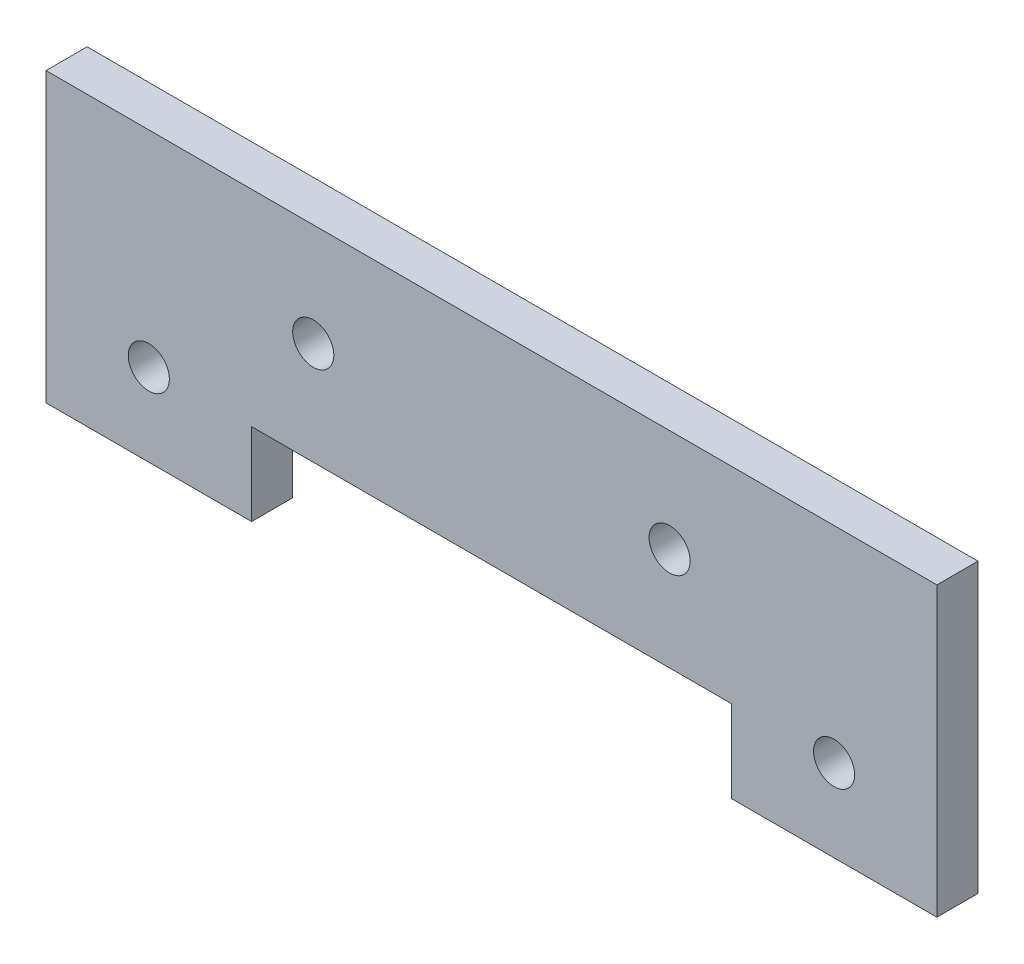
ISO-10303-21;
HEADER;
FILE_DESCRIPTION(('STEP AP214'),'2;1');
FILE_NAME('part.step','',(''),(''),'','','');
FILE_SCHEMA(('AUTOMOTIVE_DESIGN { 1 0 10303 214 1 1 1 1 }'));
ENDSEC;
DATA;
#1=APPLICATION_CONTEXT('core data for automotive mechanical design processes');
#2=APPLICATION_PROTOCOL_DEFINITION('international standard','automotive_design',2000,#1);
#3=PRODUCT_CONTEXT('',#1,'mechanical');
#4=PRODUCT('Part','Part','',(#3));
#5=PRODUCT_RELATED_PRODUCT_CATEGORY('part','',(#4));
#6=PRODUCT_DEFINITION_FORMATION('','',#4);
#7=PRODUCT_DEFINITION_CONTEXT('part definition',#1,'design');
#8=PRODUCT_DEFINITION('design','',#6,#7);
#9=PRODUCT_DEFINITION_SHAPE('','',#8);
#10=(LENGTH_UNIT() NAMED_UNIT(*) SI_UNIT(.MILLI.,.METRE.));
#11=(NAMED_UNIT(*) PLANE_ANGLE_UNIT() SI_UNIT($,.RADIAN.));
#12=(NAMED_UNIT(*) SI_UNIT($,.STERADIAN.) SOLID_ANGLE_UNIT());
#13=UNCERTAINTY_MEASURE_WITH_UNIT(LENGTH_MEASURE(1.E-05),#10,'distance_accuracy_value','');
#14=(GEOMETRIC_REPRESENTATION_CONTEXT(3) GLOBAL_UNCERTAINTY_ASSIGNED_CONTEXT((#13)) GLOBAL_UNIT_ASSIGNED_CONTEXT((#10,
#11,#12)) REPRESENTATION_CONTEXT('',''));
#15=CARTESIAN_POINT('',(0.,0.,0.));
#16=DIRECTION('',(0.,0.,1.));
#17=DIRECTION('',(1.,0.,0.));
#18=AXIS2_PLACEMENT_3D('',#15,#16,#17);
#19=CARTESIAN_POINT('',(0.,-21.,3.));
#20=DIRECTION('',(1.,0.,0.));
#21=DIRECTION('',(0.,0.,-1.));
#22=AXIS2_PLACEMENT_3D('',#19,#20,#21);
#23=PLANE('',#22);
#24=DIRECTION('',(0.,-1.,0.));
#25=VECTOR('',#24,1.);
#26=CARTESIAN_POINT('',(0.,-21.,0.));
#27=LINE('',#26,#25);
#28=CARTESIAN_POINT('',(0.,0.,0.));
#29=VERTEX_POINT('',#28);
#30=CARTESIAN_POINT('',(0.,-21.,0.));
#31=VERTEX_POINT('',#30);
#32=EDGE_CURVE('E135',#29,#31,#27,.T.);
#33=ORIENTED_EDGE('',*,*,#32,.T.);
#34=DIRECTION('',(0.,0.,-1.));
#35=VECTOR('',#34,1.);
#36=CARTESIAN_POINT('',(0.,-21.,3.));
#37=LINE('',#36,#35);
#38=CARTESIAN_POINT('',(0.,-21.,3.));
#39=VERTEX_POINT('',#38);
#40=EDGE_CURVE('E11',#39,#31,#37,.T.);
#41=ORIENTED_EDGE('',*,*,#40,.F.);
#42=DIRECTION('',(0.,-1.,0.));
#43=VECTOR('',#42,1.);
#44=CARTESIAN_POINT('',(0.,-21.,3.));
#45=LINE('',#44,#43);
#46=CARTESIAN_POINT('',(0.,0.,3.));
#47=VERTEX_POINT('',#46);
#48=EDGE_CURVE('E150',#47,#39,#45,.T.);
#49=ORIENTED_EDGE('',*,*,#48,.F.);
#50=DIRECTION('',(0.,0.,-1.));
#51=VECTOR('',#50,1.);
#52=CARTESIAN_POINT('',(0.,0.,3.));
#53=LINE('',#52,#51);
#54=EDGE_CURVE('E131',#47,#29,#53,.T.);
#55=ORIENTED_EDGE('',*,*,#54,.T.);
#56=EDGE_LOOP('',(#33,#41,#49,#55));
#57=FACE_BOUND('',#56,.T.);
#58=ADVANCED_FACE('F39',(#57),#23,.F.);
#59=CARTESIAN_POINT('',(15.,-21.,3.));
#60=DIRECTION('',(0.,1.,0.));
#61=DIRECTION('',(-1.,0.,0.));
#62=AXIS2_PLACEMENT_3D('',#59,#60,#61);
#63=PLANE('',#62);
#64=DIRECTION('',(1.,0.,0.));
#65=VECTOR('',#64,1.);
#66=CARTESIAN_POINT('',(15.,-21.,0.));
#67=LINE('',#66,#65);
#68=CARTESIAN_POINT('',(15.,-21.,0.));
#69=VERTEX_POINT('',#68);
#70=EDGE_CURVE('E138',#31,#69,#67,.T.);
#71=ORIENTED_EDGE('',*,*,#70,.T.);
#72=DIRECTION('',(0.,0.,-1.));
#73=VECTOR('',#72,1.);
#74=CARTESIAN_POINT('',(15.,-21.,3.));
#75=LINE('',#74,#73);
#76=CARTESIAN_POINT('',(15.,-21.,3.));
#77=VERTEX_POINT('',#76);
#78=EDGE_CURVE('E47',#77,#69,#75,.T.);
#79=ORIENTED_EDGE('',*,*,#78,.F.);
#80=DIRECTION('',(1.,0.,0.));
#81=VECTOR('',#80,1.);
#82=CARTESIAN_POINT('',(15.,-21.,3.));
#83=LINE('',#82,#81);
#84=EDGE_CURVE('E98',#39,#77,#83,.T.);
#85=ORIENTED_EDGE('',*,*,#84,.F.);
#86=ORIENTED_EDGE('',*,*,#40,.T.);
#87=EDGE_LOOP('',(#71,#79,#85,#86));
#88=FACE_BOUND('',#87,.T.);
#89=ADVANCED_FACE('F241',(#88),#63,.F.);
#90=CARTESIAN_POINT('',(15.,-15.,3.));
#91=DIRECTION('',(-1.,0.,0.));
#92=DIRECTION('',(0.,-1.,0.));
#93=AXIS2_PLACEMENT_3D('',#90,#91,#92);
#94=PLANE('',#93);
#95=DIRECTION('',(0.,1.,0.));
#96=VECTOR('',#95,1.);
#97=CARTESIAN_POINT('',(15.,-15.,0.));
#98=LINE('',#97,#96);
#99=CARTESIAN_POINT('',(15.,-15.,0.));
#100=VERTEX_POINT('',#99);
#101=EDGE_CURVE('E141',#69,#100,#98,.T.);
#102=ORIENTED_EDGE('',*,*,#101,.T.);
#103=DIRECTION('',(0.,0.,-1.));
#104=VECTOR('',#103,1.);
#105=CARTESIAN_POINT('',(15.,-15.,3.));
#106=LINE('',#105,#104);
#107=CARTESIAN_POINT('',(15.,-15.,3.));
#108=VERTEX_POINT('',#107);
#109=EDGE_CURVE('E157',#108,#100,#106,.T.);
#110=ORIENTED_EDGE('',*,*,#109,.F.);
#111=DIRECTION('',(0.,1.,0.));
#112=VECTOR('',#111,1.);
#113=CARTESIAN_POINT('',(15.,-15.,3.));
#114=LINE('',#113,#112);
#115=EDGE_CURVE('E165',#77,#108,#114,.T.);
#116=ORIENTED_EDGE('',*,*,#115,.F.);
#117=ORIENTED_EDGE('',*,*,#78,.T.);
#118=EDGE_LOOP('',(#102,#110,#116,#117));
#119=FACE_BOUND('',#118,.T.);
#120=ADVANCED_FACE('F163',(#119),#94,.F.);
#121=CARTESIAN_POINT('',(50.,-15.,3.));
#122=DIRECTION('',(0.,1.,0.));
#123=DIRECTION('',(-1.,0.,0.));
#124=AXIS2_PLACEMENT_3D('',#121,#122,#123);
#125=PLANE('',#124);
#126=DIRECTION('',(1.,0.,0.));
#127=VECTOR('',#126,1.);
#128=CARTESIAN_POINT('',(50.,-15.,0.));
#129=LINE('',#128,#127);
#130=CARTESIAN_POINT('',(50.,-15.,0.));
#131=VERTEX_POINT('',#130);
#132=EDGE_CURVE('E143',#100,#131,#129,.T.);
#133=ORIENTED_EDGE('',*,*,#132,.T.);
#134=DIRECTION('',(0.,0.,-1.));
#135=VECTOR('',#134,1.);
#136=CARTESIAN_POINT('',(50.,-15.,3.));
#137=LINE('',#136,#135);
#138=CARTESIAN_POINT('',(50.,-15.,3.));
#139=VERTEX_POINT('',#138);
#140=EDGE_CURVE('E154',#139,#131,#137,.T.);
#141=ORIENTED_EDGE('',*,*,#140,.F.);
#142=DIRECTION('',(1.,0.,0.));
#143=VECTOR('',#142,1.);
#144=CARTESIAN_POINT('',(50.,-15.,3.));
#145=LINE('',#144,#143);
#146=EDGE_CURVE('E177',#108,#139,#145,.T.);
#147=ORIENTED_EDGE('',*,*,#146,.F.);
#148=ORIENTED_EDGE('',*,*,#109,.T.);
#149=EDGE_LOOP('',(#133,#141,#147,#148));
#150=FACE_BOUND('',#149,.T.);
#151=ADVANCED_FACE('F173',(#150),#125,.F.);
#152=CARTESIAN_POINT('',(50.,-21.,3.));
#153=DIRECTION('',(1.,0.,0.));
#154=DIRECTION('',(0.,0.,-1.));
#155=AXIS2_PLACEMENT_3D('',#152,#153,#154);
#156=PLANE('',#155);
#157=DIRECTION('',(0.,-1.,0.));
#158=VECTOR('',#157,1.);
#159=CARTESIAN_POINT('',(50.,-21.,0.));
#160=LINE('',#159,#158);
#161=CARTESIAN_POINT('',(50.,-21.,0.));
#162=VERTEX_POINT('',#161);
#163=EDGE_CURVE('E145',#131,#162,#160,.T.);
#164=ORIENTED_EDGE('',*,*,#163,.T.);
#165=DIRECTION('',(0.,0.,-1.));
#166=VECTOR('',#165,1.);
#167=CARTESIAN_POINT('',(50.,-21.,3.));
#168=LINE('',#167,#166);
#169=CARTESIAN_POINT('',(50.,-21.,3.));
#170=VERTEX_POINT('',#169);
#171=EDGE_CURVE('E126',#170,#162,#168,.T.);
#172=ORIENTED_EDGE('',*,*,#171,.F.);
#173=DIRECTION('',(0.,-1.,0.));
#174=VECTOR('',#173,1.);
#175=CARTESIAN_POINT('',(50.,-21.,3.));
#176=LINE('',#175,#174);
#177=EDGE_CURVE('E117',#139,#170,#176,.T.);
#178=ORIENTED_EDGE('',*,*,#177,.F.);
#179=ORIENTED_EDGE('',*,*,#140,.T.);
#180=EDGE_LOOP('',(#164,#172,#178,#179));
#181=FACE_BOUND('',#180,.T.);
#182=ADVANCED_FACE('F176',(#181),#156,.F.);
#183=CARTESIAN_POINT('',(65.,-21.,3.));
#184=DIRECTION('',(0.,1.,0.));
#185=DIRECTION('',(0.,0.,1.));
#186=AXIS2_PLACEMENT_3D('',#183,#184,#185);
#187=PLANE('',#186);
#188=DIRECTION('',(1.,0.,0.));
#189=VECTOR('',#188,1.);
#190=CARTESIAN_POINT('',(65.,-21.,0.));
#191=LINE('',#190,#189);
#192=CARTESIAN_POINT('',(65.,-21.,0.));
#193=VERTEX_POINT('',#192);
#194=EDGE_CURVE('E125',#162,#193,#191,.T.);
#195=ORIENTED_EDGE('',*,*,#194,.T.);
#196=DIRECTION('',(0.,0.,-1.));
#197=VECTOR('',#196,1.);
#198=CARTESIAN_POINT('',(65.,-21.,3.));
#199=LINE('',#198,#197);
#200=CARTESIAN_POINT('',(65.,-21.,3.));
#201=VERTEX_POINT('',#200);
#202=EDGE_CURVE('E122',#201,#193,#199,.T.);
#203=ORIENTED_EDGE('',*,*,#202,.F.);
#204=DIRECTION('',(1.,0.,0.));
#205=VECTOR('',#204,1.);
#206=CARTESIAN_POINT('',(65.,-21.,3.));
#207=LINE('',#206,#205);
#208=EDGE_CURVE('E111',#170,#201,#207,.T.);
#209=ORIENTED_EDGE('',*,*,#208,.F.);
#210=ORIENTED_EDGE('',*,*,#171,.T.);
#211=EDGE_LOOP('',(#195,#203,#209,#210));
#212=FACE_BOUND('',#211,.T.);
#213=ADVANCED_FACE('F123',(#212),#187,.F.);
#214=CARTESIAN_POINT('',(65.,0.,3.));
#215=DIRECTION('',(-1.,0.,0.));
#216=DIRECTION('',(0.,0.,1.));
#217=AXIS2_PLACEMENT_3D('',#214,#215,#216);
#218=PLANE('',#217);
#219=DIRECTION('',(0.,1.,0.));
#220=VECTOR('',#219,1.);
#221=CARTESIAN_POINT('',(65.,0.,0.));
#222=LINE('',#221,#220);
#223=CARTESIAN_POINT('',(65.,0.,0.));
#224=VERTEX_POINT('',#223);
#225=EDGE_CURVE('E84',#193,#224,#222,.T.);
#226=ORIENTED_EDGE('',*,*,#225,.T.);
#227=DIRECTION('',(0.,0.,-1.));
#228=VECTOR('',#227,1.);
#229=CARTESIAN_POINT('',(65.,0.,3.));
#230=LINE('',#229,#228);
#231=CARTESIAN_POINT('',(65.,0.,3.));
#232=VERTEX_POINT('',#231);
#233=EDGE_CURVE('E127',#232,#224,#230,.T.);
#234=ORIENTED_EDGE('',*,*,#233,.F.);
#235=DIRECTION('',(0.,1.,0.));
#236=VECTOR('',#235,1.);
#237=CARTESIAN_POINT('',(65.,0.,3.));
#238=LINE('',#237,#236);
#239=EDGE_CURVE('E115',#201,#232,#238,.T.);
#240=ORIENTED_EDGE('',*,*,#239,.F.);
#241=ORIENTED_EDGE('',*,*,#202,.T.);
#242=EDGE_LOOP('',(#226,#234,#240,#241));
#243=FACE_BOUND('',#242,.T.);
#244=ADVANCED_FACE('F129',(#243),#218,.F.);
#245=CARTESIAN_POINT('',(0.,0.,3.));
#246=DIRECTION('',(0.,-1.,0.));
#247=DIRECTION('',(0.,0.,-1.));
#248=AXIS2_PLACEMENT_3D('',#245,#246,#247);
#249=PLANE('',#248);
#250=DIRECTION('',(-1.,0.,0.));
#251=VECTOR('',#250,1.);
#252=CARTESIAN_POINT('',(0.,0.,0.));
#253=LINE('',#252,#251);
#254=EDGE_CURVE('E90',#224,#29,#253,.T.);
#255=ORIENTED_EDGE('',*,*,#254,.T.);
#256=ORIENTED_EDGE('',*,*,#54,.F.);
#257=DIRECTION('',(-1.,0.,0.));
#258=VECTOR('',#257,1.);
#259=CARTESIAN_POINT('',(0.,0.,3.));
#260=LINE('',#259,#258);
#261=EDGE_CURVE('E55',#232,#47,#260,.T.);
#262=ORIENTED_EDGE('',*,*,#261,.F.);
#263=ORIENTED_EDGE('',*,*,#233,.T.);
#264=EDGE_LOOP('',(#255,#256,#262,#263));
#265=FACE_BOUND('',#264,.T.);
#266=ADVANCED_FACE('F218',(#265),#249,.F.);
#267=CARTESIAN_POINT('',(0.,0.,3.));
#268=DIRECTION('',(0.,0.,-1.));
#269=DIRECTION('',(-1.,0.,0.));
#270=AXIS2_PLACEMENT_3D('',#267,#268,#269);
#271=PLANE('',#270);
#272=CARTESIAN_POINT('',(7.5,-15.,3.));
#273=DIRECTION('',(0.,0.,1.));
#274=DIRECTION('',(1.,0.,0.));
#275=AXIS2_PLACEMENT_3D('',#272,#273,#274);
#276=CIRCLE('',#275,1.5);
#277=CARTESIAN_POINT('',(9.,-15.,3.));
#278=VERTEX_POINT('',#277);
#279=EDGE_CURVE('E196',#278,#278,#276,.T.);
#280=ORIENTED_EDGE('',*,*,#279,.F.);
#281=EDGE_LOOP('',(#280));
#282=FACE_BOUND('',#281,.T.);
#283=CARTESIAN_POINT('',(45.5,-7.5,3.));
#284=DIRECTION('',(0.,0.,1.));
#285=DIRECTION('',(1.,0.,0.));
#286=AXIS2_PLACEMENT_3D('',#283,#284,#285);
#287=CIRCLE('',#286,1.5);
#288=CARTESIAN_POINT('',(47.,-7.5,3.));
#289=VERTEX_POINT('',#288);
#290=EDGE_CURVE('E197',#289,#289,#287,.T.);
#291=ORIENTED_EDGE('',*,*,#290,.F.);
#292=EDGE_LOOP('',(#291));
#293=FACE_BOUND('',#292,.T.);
#294=CARTESIAN_POINT('',(19.5,-7.5,3.));
#295=DIRECTION('',(0.,0.,1.));
#296=DIRECTION('',(1.,0.,0.));
#297=AXIS2_PLACEMENT_3D('',#294,#295,#296);
#298=CIRCLE('',#297,1.5);
#299=CARTESIAN_POINT('',(21.,-7.5,3.));
#300=VERTEX_POINT('',#299);
#301=EDGE_CURVE('E183',#300,#300,#298,.T.);
#302=ORIENTED_EDGE('',*,*,#301,.F.);
#303=EDGE_LOOP('',(#302));
#304=FACE_BOUND('',#303,.T.);
#305=CARTESIAN_POINT('',(57.5,-15.,3.));
#306=DIRECTION('',(0.,0.,1.));
#307=DIRECTION('',(1.,0.,0.));
#308=AXIS2_PLACEMENT_3D('',#305,#306,#307);
#309=CIRCLE('',#308,1.5);
#310=CARTESIAN_POINT('',(59.,-15.,3.));
#311=VERTEX_POINT('',#310);
#312=EDGE_CURVE('E190',#311,#311,#309,.T.);
#313=ORIENTED_EDGE('',*,*,#312,.F.);
#314=EDGE_LOOP('',(#313));
#315=FACE_BOUND('',#314,.T.);
#316=ORIENTED_EDGE('',*,*,#48,.T.);
#317=ORIENTED_EDGE('',*,*,#84,.T.);
#318=ORIENTED_EDGE('',*,*,#115,.T.);
#319=ORIENTED_EDGE('',*,*,#146,.T.);
#320=ORIENTED_EDGE('',*,*,#177,.T.);
#321=ORIENTED_EDGE('',*,*,#208,.T.);
#322=ORIENTED_EDGE('',*,*,#239,.T.);
#323=ORIENTED_EDGE('',*,*,#261,.T.);
#324=EDGE_LOOP('',(#316,#317,#318,#319,#320,#321,#322,#323));
#325=FACE_BOUND('',#324,.T.);
#326=ADVANCED_FACE('F113',(#282,#293,#304,#315,#325),#271,.F.);
#327=CARTESIAN_POINT('',(0.,0.,0.));
#328=DIRECTION('',(0.,0.,-1.));
#329=DIRECTION('',(-1.,0.,0.));
#330=AXIS2_PLACEMENT_3D('',#327,#328,#329);
#331=PLANE('',#330);
#332=CARTESIAN_POINT('',(7.5,-15.,0.));
#333=DIRECTION('',(0.,0.,1.));
#334=DIRECTION('',(1.,0.,0.));
#335=AXIS2_PLACEMENT_3D('',#332,#333,#334);
#336=CIRCLE('',#335,1.5);
#337=CARTESIAN_POINT('',(9.,-15.,0.));
#338=VERTEX_POINT('',#337);
#339=EDGE_CURVE('E139',#338,#338,#336,.T.);
#340=ORIENTED_EDGE('',*,*,#339,.T.);
#341=EDGE_LOOP('',(#340));
#342=FACE_BOUND('',#341,.T.);
#343=CARTESIAN_POINT('',(45.5,-7.5,0.));
#344=DIRECTION('',(0.,0.,1.));
#345=DIRECTION('',(1.,0.,0.));
#346=AXIS2_PLACEMENT_3D('',#343,#344,#345);
#347=CIRCLE('',#346,1.5);
#348=CARTESIAN_POINT('',(47.,-7.5,0.));
#349=VERTEX_POINT('',#348);
#350=EDGE_CURVE('E187',#349,#349,#347,.T.);
#351=ORIENTED_EDGE('',*,*,#350,.T.);
#352=EDGE_LOOP('',(#351));
#353=FACE_BOUND('',#352,.T.);
#354=CARTESIAN_POINT('',(19.5,-7.5,0.));
#355=DIRECTION('',(0.,0.,1.));
#356=DIRECTION('',(1.,0.,0.));
#357=AXIS2_PLACEMENT_3D('',#354,#355,#356);
#358=CIRCLE('',#357,1.5);
#359=CARTESIAN_POINT('',(21.,-7.5,0.));
#360=VERTEX_POINT('',#359);
#361=EDGE_CURVE('E186',#360,#360,#358,.T.);
#362=ORIENTED_EDGE('',*,*,#361,.T.);
#363=EDGE_LOOP('',(#362));
#364=FACE_BOUND('',#363,.T.);
#365=CARTESIAN_POINT('',(57.5,-15.,0.));
#366=DIRECTION('',(0.,0.,1.));
#367=DIRECTION('',(1.,0.,0.));
#368=AXIS2_PLACEMENT_3D('',#365,#366,#367);
#369=CIRCLE('',#368,1.5);
#370=CARTESIAN_POINT('',(59.,-15.,0.));
#371=VERTEX_POINT('',#370);
#372=EDGE_CURVE('E193',#371,#371,#369,.T.);
#373=ORIENTED_EDGE('',*,*,#372,.T.);
#374=EDGE_LOOP('',(#373));
#375=FACE_BOUND('',#374,.T.);
#376=ORIENTED_EDGE('',*,*,#32,.F.);
#377=ORIENTED_EDGE('',*,*,#254,.F.);
#378=ORIENTED_EDGE('',*,*,#225,.F.);
#379=ORIENTED_EDGE('',*,*,#194,.F.);
#380=ORIENTED_EDGE('',*,*,#163,.F.);
#381=ORIENTED_EDGE('',*,*,#132,.F.);
#382=ORIENTED_EDGE('',*,*,#101,.F.);
#383=ORIENTED_EDGE('',*,*,#70,.F.);
#384=EDGE_LOOP('',(#376,#377,#378,#379,#380,#381,#382,#383));
#385=FACE_BOUND('',#384,.T.);
#386=ADVANCED_FACE('F169',(#342,#353,#364,#375,#385),#331,.T.);
#387=CARTESIAN_POINT('',(57.5,-15.,0.));
#388=DIRECTION('',(0.,0.,1.));
#389=DIRECTION('',(1.,0.,0.));
#390=AXIS2_PLACEMENT_3D('',#387,#388,#389);
#391=CYLINDRICAL_SURFACE('',#390,1.5);
#392=ORIENTED_EDGE('',*,*,#372,.F.);
#393=EDGE_LOOP('',(#392));
#394=FACE_BOUND('',#393,.T.);
#395=ORIENTED_EDGE('',*,*,#312,.T.);
#396=EDGE_LOOP('',(#395));
#397=FACE_BOUND('',#396,.T.);
#398=ADVANCED_FACE('F226',(#394,#397),#391,.F.);
#399=CARTESIAN_POINT('',(19.5,-7.5,0.));
#400=DIRECTION('',(0.,0.,1.));
#401=DIRECTION('',(1.,0.,0.));
#402=AXIS2_PLACEMENT_3D('',#399,#400,#401);
#403=CYLINDRICAL_SURFACE('',#402,1.5);
#404=ORIENTED_EDGE('',*,*,#361,.F.);
#405=EDGE_LOOP('',(#404));
#406=FACE_BOUND('',#405,.T.);
#407=ORIENTED_EDGE('',*,*,#301,.T.);
#408=EDGE_LOOP('',(#407));
#409=FACE_BOUND('',#408,.T.);
#410=ADVANCED_FACE('F228',(#406,#409),#403,.F.);
#411=CARTESIAN_POINT('',(45.5,-7.5,0.));
#412=DIRECTION('',(0.,0.,1.));
#413=DIRECTION('',(1.,0.,0.));
#414=AXIS2_PLACEMENT_3D('',#411,#412,#413);
#415=CYLINDRICAL_SURFACE('',#414,1.5);
#416=ORIENTED_EDGE('',*,*,#350,.F.);
#417=EDGE_LOOP('',(#416));
#418=FACE_BOUND('',#417,.T.);
#419=ORIENTED_EDGE('',*,*,#290,.T.);
#420=EDGE_LOOP('',(#419));
#421=FACE_BOUND('',#420,.T.);
#422=ADVANCED_FACE('F212',(#418,#421),#415,.F.);
#423=CARTESIAN_POINT('',(7.5,-15.,0.));
#424=DIRECTION('',(0.,0.,1.));
#425=DIRECTION('',(1.,0.,0.));
#426=AXIS2_PLACEMENT_3D('',#423,#424,#425);
#427=CYLINDRICAL_SURFACE('',#426,1.5);
#428=ORIENTED_EDGE('',*,*,#339,.F.);
#429=EDGE_LOOP('',(#428));
#430=FACE_BOUND('',#429,.T.);
#431=ORIENTED_EDGE('',*,*,#279,.T.);
#432=EDGE_LOOP('',(#431));
#433=FACE_BOUND('',#432,.T.);
#434=ADVANCED_FACE('F209',(#430,#433),#427,.F.);
#435=CLOSED_SHELL('',(#58,#89,#120,#151,#182,#213,#244,#266,#326,#386,#398,#410,#422,#434));
#436=MANIFOLD_SOLID_BREP('B2',#435);
#437=ADVANCED_BREP_SHAPE_REPRESENTATION('',(#18,#436),#14);
#438=SHAPE_DEFINITION_REPRESENTATION(#9,#437);
ENDSEC;
END-ISO-10303-21;
